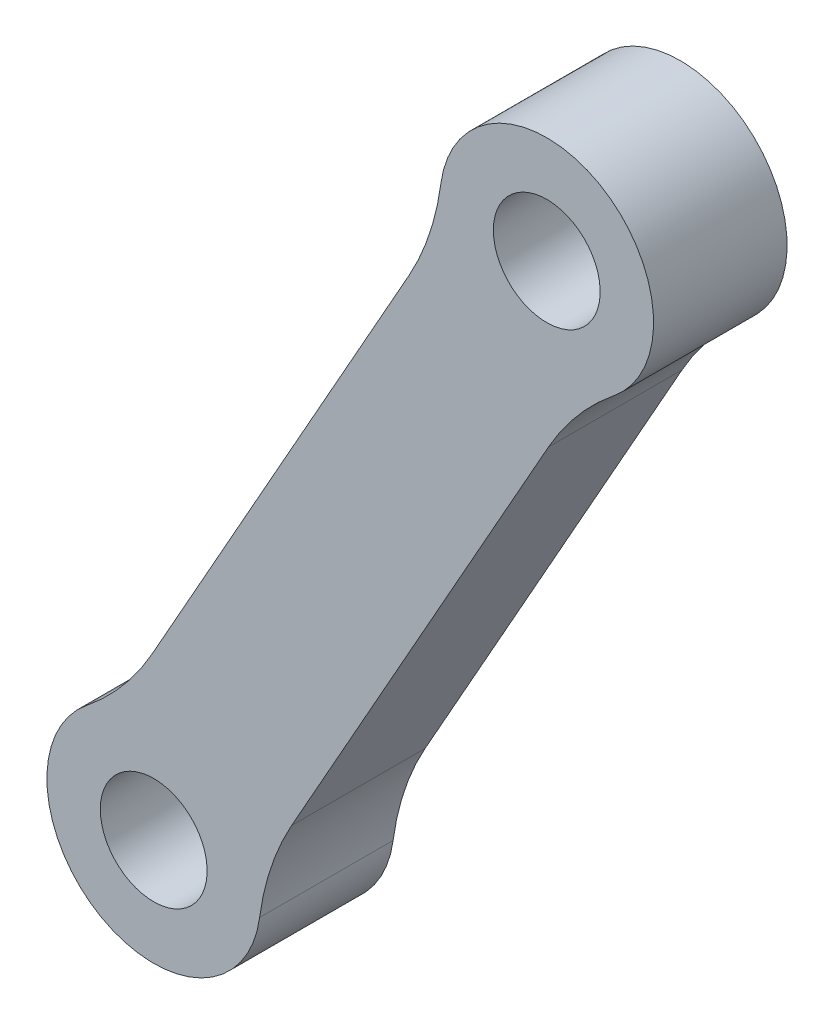
ISO-10303-21;
HEADER;
FILE_DESCRIPTION(('STEP AP214'),'2;1');
FILE_NAME('part.step','',(''),(''),'','','');
FILE_SCHEMA(('AUTOMOTIVE_DESIGN { 1 0 10303 214 1 1 1 1 }'));
ENDSEC;
DATA;
#1=APPLICATION_CONTEXT('core data for automotive mechanical design processes');
#2=APPLICATION_PROTOCOL_DEFINITION('international standard','automotive_design',2000,#1);
#3=PRODUCT_CONTEXT('',#1,'mechanical');
#4=PRODUCT('Part','Part','',(#3));
#5=PRODUCT_RELATED_PRODUCT_CATEGORY('part','',(#4));
#6=PRODUCT_DEFINITION_FORMATION('','',#4);
#7=PRODUCT_DEFINITION_CONTEXT('part definition',#1,'design');
#8=PRODUCT_DEFINITION('design','',#6,#7);
#9=PRODUCT_DEFINITION_SHAPE('','',#8);
#10=(LENGTH_UNIT() NAMED_UNIT(*) SI_UNIT(.MILLI.,.METRE.));
#11=(NAMED_UNIT(*) PLANE_ANGLE_UNIT() SI_UNIT($,.RADIAN.));
#12=(NAMED_UNIT(*) SI_UNIT($,.STERADIAN.) SOLID_ANGLE_UNIT());
#13=UNCERTAINTY_MEASURE_WITH_UNIT(LENGTH_MEASURE(1.E-05),#10,'distance_accuracy_value','');
#14=(GEOMETRIC_REPRESENTATION_CONTEXT(3) GLOBAL_UNCERTAINTY_ASSIGNED_CONTEXT((#13)) GLOBAL_UNIT_ASSIGNED_CONTEXT((#10,
#11,#12)) REPRESENTATION_CONTEXT('',''));
#15=CARTESIAN_POINT('',(0.,0.,0.));
#16=DIRECTION('',(0.,0.,1.));
#17=DIRECTION('',(1.,0.,0.));
#18=AXIS2_PLACEMENT_3D('',#15,#16,#17);
#19=CARTESIAN_POINT('',(22.1237617464884,10.2934075170326,58.));
#20=DIRECTION('',(0.,0.,1.));
#21=DIRECTION('',(1.,0.,0.));
#22=AXIS2_PLACEMENT_3D('',#19,#20,#21);
#23=CYLINDRICAL_SURFACE('',#22,10.);
#24=CARTESIAN_POINT('',(22.1237617464884,10.2934075170326,63.));
#25=DIRECTION('',(0.,0.,-1.));
#26=DIRECTION('',(-1.,0.,0.));
#27=AXIS2_PLACEMENT_3D('',#24,#25,#26);
#28=CIRCLE('',#27,10.);
#29=CARTESIAN_POINT('',(12.2115050047554,11.6152116954073,63.));
#30=VERTEX_POINT('',#29);
#31=CARTESIAN_POINT('',(13.4101159137224,15.1997683171695,63.));
#32=VERTEX_POINT('',#31);
#33=EDGE_CURVE('E134',#30,#32,#28,.T.);
#34=ORIENTED_EDGE('',*,*,#33,.F.);
#35=DIRECTION('',(0.,0.,1.));
#36=VECTOR('',#35,1.);
#37=CARTESIAN_POINT('',(12.2115050047554,11.6152116954073,58.));
#38=LINE('',#37,#36);
#39=CARTESIAN_POINT('',(12.2115050047554,11.6152116954073,58.));
#40=VERTEX_POINT('',#39);
#41=EDGE_CURVE('E11',#40,#30,#38,.T.);
#42=ORIENTED_EDGE('',*,*,#41,.F.);
#43=CARTESIAN_POINT('',(22.1237617464884,10.2934075170326,58.));
#44=DIRECTION('',(0.,0.,-1.));
#45=DIRECTION('',(-1.,0.,0.));
#46=AXIS2_PLACEMENT_3D('',#43,#44,#45);
#47=CIRCLE('',#46,10.);
#48=CARTESIAN_POINT('',(13.4101159137224,15.1997683171695,58.));
#49=VERTEX_POINT('',#48);
#50=EDGE_CURVE('E155',#40,#49,#47,.T.);
#51=ORIENTED_EDGE('',*,*,#50,.T.);
#52=DIRECTION('',(0.,0.,1.));
#53=VECTOR('',#52,1.);
#54=CARTESIAN_POINT('',(13.4101159137224,15.1997683171695,58.));
#55=LINE('',#54,#53);
#56=EDGE_CURVE('E40',#49,#32,#55,.T.);
#57=ORIENTED_EDGE('',*,*,#56,.T.);
#58=EDGE_LOOP('',(#34,#42,#51,#57));
#59=FACE_BOUND('',#58,.T.);
#60=ADVANCED_FACE('F37',(#59),#23,.F.);
#61=CARTESIAN_POINT('',(8.24660230806223,12.1439333667572,58.));
#62=DIRECTION('',(0.,0.,1.));
#63=DIRECTION('',(1.,0.,0.));
#64=AXIS2_PLACEMENT_3D('',#61,#62,#63);
#65=CYLINDRICAL_SURFACE('',#64,3.99999999999999);
#66=CARTESIAN_POINT('',(8.24660230806223,12.1439333667572,63.));
#67=DIRECTION('',(0.,0.,1.));
#68=DIRECTION('',(1.,0.,0.));
#69=AXIS2_PLACEMENT_3D('',#66,#67,#68);
#70=CIRCLE('',#69,3.99999999999999);
#71=CARTESIAN_POINT('',(5.73851095755782,15.2599368612233,63.));
#72=VERTEX_POINT('',#71);
#73=EDGE_CURVE('E153',#72,#30,#70,.T.);
#74=ORIENTED_EDGE('',*,*,#73,.F.);
#75=DIRECTION('',(0.,0.,1.));
#76=VECTOR('',#75,1.);
#77=CARTESIAN_POINT('',(5.73851095755782,15.2599368612233,58.));
#78=LINE('',#77,#76);
#79=CARTESIAN_POINT('',(5.73851095755782,15.2599368612233,58.));
#80=VERTEX_POINT('',#79);
#81=EDGE_CURVE('E46',#80,#72,#78,.T.);
#82=ORIENTED_EDGE('',*,*,#81,.F.);
#83=CARTESIAN_POINT('',(8.24660230806223,12.1439333667572,58.));
#84=DIRECTION('',(0.,0.,1.));
#85=DIRECTION('',(1.,0.,0.));
#86=AXIS2_PLACEMENT_3D('',#83,#84,#85);
#87=CIRCLE('',#86,3.99999999999999);
#88=EDGE_CURVE('E124',#80,#40,#87,.T.);
#89=ORIENTED_EDGE('',*,*,#88,.T.);
#90=ORIENTED_EDGE('',*,*,#41,.T.);
#91=EDGE_LOOP('',(#74,#82,#89,#90));
#92=FACE_BOUND('',#91,.T.);
#93=ADVANCED_FACE('F167',(#92),#65,.T.);
#94=CARTESIAN_POINT('',(-0.531717418703122,23.0499455973886,58.));
#95=DIRECTION('',(0.,0.,1.));
#96=DIRECTION('',(1.,0.,0.));
#97=AXIS2_PLACEMENT_3D('',#94,#95,#96);
#98=CYLINDRICAL_SURFACE('',#97,10.);
#99=CARTESIAN_POINT('',(-0.531717418703122,23.0499455973886,63.));
#100=DIRECTION('',(0.,0.,-1.));
#101=DIRECTION('',(-1.,0.,0.));
#102=AXIS2_PLACEMENT_3D('',#99,#100,#101);
#103=CIRCLE('',#102,10.);
#104=CARTESIAN_POINT('',(8.18192841406284,18.1435847972517,63.));
#105=VERTEX_POINT('',#104);
#106=EDGE_CURVE('E111',#105,#72,#103,.T.);
#107=ORIENTED_EDGE('',*,*,#106,.F.);
#108=DIRECTION('',(0.,0.,1.));
#109=VECTOR('',#108,1.);
#110=CARTESIAN_POINT('',(8.18192841406284,18.1435847972517,58.));
#111=LINE('',#110,#109);
#112=CARTESIAN_POINT('',(8.18192841406284,18.1435847972517,58.));
#113=VERTEX_POINT('',#112);
#114=EDGE_CURVE('E106',#113,#105,#111,.T.);
#115=ORIENTED_EDGE('',*,*,#114,.F.);
#116=CARTESIAN_POINT('',(-0.531717418703122,23.0499455973886,58.));
#117=DIRECTION('',(0.,0.,-1.));
#118=DIRECTION('',(-1.,0.,0.));
#119=AXIS2_PLACEMENT_3D('',#116,#117,#118);
#120=CIRCLE('',#119,10.);
#121=EDGE_CURVE('E109',#113,#80,#120,.T.);
#122=ORIENTED_EDGE('',*,*,#121,.T.);
#123=ORIENTED_EDGE('',*,*,#81,.T.);
#124=EDGE_LOOP('',(#107,#115,#122,#123));
#125=FACE_BOUND('',#124,.T.);
#126=ADVANCED_FACE('F108',(#125),#98,.F.);
#127=CARTESIAN_POINT('',(17.8021711028128,35.2290359146427,58.));
#128=DIRECTION('',(-0.871364583276596,0.490636080013694,0.));
#129=DIRECTION('',(-0.490636080013694,-0.871364583276596,0.));
#130=AXIS2_PLACEMENT_3D('',#127,#128,#129);
#131=PLANE('',#130);
#132=DIRECTION('',(-0.490636080013694,-0.871364583276596,0.));
#133=VECTOR('',#132,1.);
#134=CARTESIAN_POINT('',(17.8021711028128,35.2290359146427,63.));
#135=LINE('',#134,#133);
#136=CARTESIAN_POINT('',(17.8021711028128,35.2290359146427,63.));
#137=VERTEX_POINT('',#136);
#138=EDGE_CURVE('E150',#137,#105,#135,.T.);
#139=ORIENTED_EDGE('',*,*,#138,.F.);
#140=DIRECTION('',(0.,0.,1.));
#141=VECTOR('',#140,1.);
#142=CARTESIAN_POINT('',(17.8021711028128,35.2290359146427,58.));
#143=LINE('',#142,#141);
#144=CARTESIAN_POINT('',(17.8021711028128,35.2290359146427,58.));
#145=VERTEX_POINT('',#144);
#146=EDGE_CURVE('E116',#145,#137,#143,.T.);
#147=ORIENTED_EDGE('',*,*,#146,.F.);
#148=DIRECTION('',(-0.490636080013694,-0.871364583276596,0.));
#149=VECTOR('',#148,1.);
#150=CARTESIAN_POINT('',(17.8021711028128,35.2290359146427,58.));
#151=LINE('',#150,#149);
#152=EDGE_CURVE('E122',#145,#113,#151,.T.);
#153=ORIENTED_EDGE('',*,*,#152,.T.);
#154=ORIENTED_EDGE('',*,*,#114,.T.);
#155=EDGE_LOOP('',(#139,#147,#153,#154));
#156=FACE_BOUND('',#155,.T.);
#157=ADVANCED_FACE('F126',(#156),#131,.T.);
#158=CARTESIAN_POINT('',(9.08852527004682,40.1353967147796,58.));
#159=DIRECTION('',(0.,0.,1.));
#160=DIRECTION('',(1.,0.,0.));
#161=AXIS2_PLACEMENT_3D('',#158,#159,#160);
#162=CYLINDRICAL_SURFACE('',#161,10.);
#163=CARTESIAN_POINT('',(9.08852527004682,40.1353967147796,63.));
#164=DIRECTION('',(0.,0.,-1.));
#165=DIRECTION('',(-1.,0.,0.));
#166=AXIS2_PLACEMENT_3D('',#163,#164,#165);
#167=CIRCLE('',#166,10.);
#168=CARTESIAN_POINT('',(19.0007820117798,38.8135925364049,63.));
#169=VERTEX_POINT('',#168);
#170=EDGE_CURVE('E147',#169,#137,#167,.T.);
#171=ORIENTED_EDGE('',*,*,#170,.F.);
#172=DIRECTION('',(0.,0.,1.));
#173=VECTOR('',#172,1.);
#174=CARTESIAN_POINT('',(19.0007820117798,38.8135925364049,58.));
#175=LINE('',#174,#173);
#176=CARTESIAN_POINT('',(19.0007820117798,38.8135925364049,58.));
#177=VERTEX_POINT('',#176);
#178=EDGE_CURVE('E159',#177,#169,#175,.T.);
#179=ORIENTED_EDGE('',*,*,#178,.F.);
#180=CARTESIAN_POINT('',(9.08852527004682,40.1353967147796,58.));
#181=DIRECTION('',(0.,0.,-1.));
#182=DIRECTION('',(-1.,0.,0.));
#183=AXIS2_PLACEMENT_3D('',#180,#181,#182);
#184=CIRCLE('',#183,10.);
#185=EDGE_CURVE('E127',#177,#145,#184,.T.);
#186=ORIENTED_EDGE('',*,*,#185,.T.);
#187=ORIENTED_EDGE('',*,*,#146,.T.);
#188=EDGE_LOOP('',(#171,#179,#186,#187));
#189=FACE_BOUND('',#188,.T.);
#190=ADVANCED_FACE('F180',(#189),#162,.F.);
#191=CARTESIAN_POINT('',(22.965684708473,38.284870865055,58.));
#192=DIRECTION('',(0.,0.,1.));
#193=DIRECTION('',(1.,0.,0.));
#194=AXIS2_PLACEMENT_3D('',#191,#192,#193);
#195=CYLINDRICAL_SURFACE('',#194,4.);
#196=CARTESIAN_POINT('',(22.965684708473,38.284870865055,63.));
#197=DIRECTION('',(0.,0.,1.));
#198=DIRECTION('',(1.,0.,0.));
#199=AXIS2_PLACEMENT_3D('',#196,#197,#198);
#200=CIRCLE('',#199,4.);
#201=CARTESIAN_POINT('',(25.4737760589774,35.1688673705889,63.));
#202=VERTEX_POINT('',#201);
#203=EDGE_CURVE('E144',#202,#169,#200,.T.);
#204=ORIENTED_EDGE('',*,*,#203,.F.);
#205=DIRECTION('',(0.,0.,1.));
#206=VECTOR('',#205,1.);
#207=CARTESIAN_POINT('',(25.4737760589774,35.1688673705889,58.));
#208=LINE('',#207,#206);
#209=CARTESIAN_POINT('',(25.4737760589774,35.1688673705889,58.));
#210=VERTEX_POINT('',#209);
#211=EDGE_CURVE('E161',#210,#202,#208,.T.);
#212=ORIENTED_EDGE('',*,*,#211,.F.);
#213=CARTESIAN_POINT('',(22.965684708473,38.284870865055,58.));
#214=DIRECTION('',(0.,0.,1.));
#215=DIRECTION('',(1.,0.,0.));
#216=AXIS2_PLACEMENT_3D('',#213,#214,#215);
#217=CIRCLE('',#216,4.);
#218=EDGE_CURVE('E129',#210,#177,#217,.T.);
#219=ORIENTED_EDGE('',*,*,#218,.T.);
#220=ORIENTED_EDGE('',*,*,#178,.T.);
#221=EDGE_LOOP('',(#204,#212,#219,#220));
#222=FACE_BOUND('',#221,.T.);
#223=ADVANCED_FACE('F183',(#222),#195,.T.);
#224=CARTESIAN_POINT('',(31.7440044352383,27.3788586344236,58.));
#225=DIRECTION('',(0.,0.,1.));
#226=DIRECTION('',(1.,0.,0.));
#227=AXIS2_PLACEMENT_3D('',#224,#225,#226);
#228=CYLINDRICAL_SURFACE('',#227,10.);
#229=CARTESIAN_POINT('',(31.7440044352383,27.3788586344236,63.));
#230=DIRECTION('',(0.,0.,-1.));
#231=DIRECTION('',(-1.,0.,0.));
#232=AXIS2_PLACEMENT_3D('',#229,#230,#231);
#233=CIRCLE('',#232,10.);
#234=CARTESIAN_POINT('',(23.0303586024724,32.2852194345605,63.));
#235=VERTEX_POINT('',#234);
#236=EDGE_CURVE('E141',#235,#202,#233,.T.);
#237=ORIENTED_EDGE('',*,*,#236,.F.);
#238=DIRECTION('',(0.,0.,1.));
#239=VECTOR('',#238,1.);
#240=CARTESIAN_POINT('',(23.0303586024724,32.2852194345605,58.));
#241=LINE('',#240,#239);
#242=CARTESIAN_POINT('',(23.0303586024724,32.2852194345605,58.));
#243=VERTEX_POINT('',#242);
#244=EDGE_CURVE('E162',#243,#235,#241,.T.);
#245=ORIENTED_EDGE('',*,*,#244,.F.);
#246=CARTESIAN_POINT('',(31.7440044352383,27.3788586344236,58.));
#247=DIRECTION('',(0.,0.,-1.));
#248=DIRECTION('',(-1.,0.,0.));
#249=AXIS2_PLACEMENT_3D('',#246,#247,#248);
#250=CIRCLE('',#249,10.);
#251=EDGE_CURVE('E229',#243,#210,#250,.T.);
#252=ORIENTED_EDGE('',*,*,#251,.T.);
#253=ORIENTED_EDGE('',*,*,#211,.T.);
#254=EDGE_LOOP('',(#237,#245,#252,#253));
#255=FACE_BOUND('',#254,.T.);
#256=ADVANCED_FACE('F187',(#255),#228,.F.);
#257=CARTESIAN_POINT('',(13.4101159137224,15.1997683171695,58.));
#258=DIRECTION('',(0.871364583276596,-0.490636080013694,0.));
#259=DIRECTION('',(0.490636080013694,0.871364583276596,0.));
#260=AXIS2_PLACEMENT_3D('',#257,#258,#259);
#261=PLANE('',#260);
#262=DIRECTION('',(0.490636080013694,0.871364583276596,0.));
#263=VECTOR('',#262,1.);
#264=CARTESIAN_POINT('',(13.4101159137224,15.1997683171695,63.));
#265=LINE('',#264,#263);
#266=EDGE_CURVE('E137',#32,#235,#265,.T.);
#267=ORIENTED_EDGE('',*,*,#266,.F.);
#268=ORIENTED_EDGE('',*,*,#56,.F.);
#269=DIRECTION('',(0.490636080013694,0.871364583276596,0.));
#270=VECTOR('',#269,1.);
#271=CARTESIAN_POINT('',(13.4101159137224,15.1997683171695,58.));
#272=LINE('',#271,#270);
#273=EDGE_CURVE('E227',#49,#243,#272,.T.);
#274=ORIENTED_EDGE('',*,*,#273,.T.);
#275=ORIENTED_EDGE('',*,*,#244,.T.);
#276=EDGE_LOOP('',(#267,#268,#274,#275));
#277=FACE_BOUND('',#276,.T.);
#278=ADVANCED_FACE('F164',(#277),#261,.T.);
#279=CARTESIAN_POINT('',(22.1237617464884,10.2934075170326,58.));
#280=DIRECTION('',(0.,0.,-1.));
#281=DIRECTION('',(-1.,0.,0.));
#282=AXIS2_PLACEMENT_3D('',#279,#280,#281);
#283=PLANE('',#282);
#284=CARTESIAN_POINT('',(22.965684708473,38.284870865055,58.));
#285=DIRECTION('',(0.,0.,1.));
#286=DIRECTION('',(-1.,0.,0.));
#287=AXIS2_PLACEMENT_3D('',#284,#285,#286);
#288=CIRCLE('',#287,2.);
#289=CARTESIAN_POINT('',(20.965684708473,38.284870865055,58.));
#290=VERTEX_POINT('',#289);
#291=EDGE_CURVE('E214',#290,#290,#288,.T.);
#292=ORIENTED_EDGE('',*,*,#291,.T.);
#293=EDGE_LOOP('',(#292));
#294=FACE_BOUND('',#293,.T.);
#295=CARTESIAN_POINT('',(8.24660230806223,12.1439333667572,58.));
#296=DIRECTION('',(0.,0.,1.));
#297=DIRECTION('',(-1.,0.,0.));
#298=AXIS2_PLACEMENT_3D('',#295,#296,#297);
#299=CIRCLE('',#298,2.);
#300=CARTESIAN_POINT('',(6.24660230806223,12.1439333667572,58.));
#301=VERTEX_POINT('',#300);
#302=EDGE_CURVE('E138',#301,#301,#299,.T.);
#303=ORIENTED_EDGE('',*,*,#302,.T.);
#304=EDGE_LOOP('',(#303));
#305=FACE_BOUND('',#304,.T.);
#306=ORIENTED_EDGE('',*,*,#50,.F.);
#307=ORIENTED_EDGE('',*,*,#88,.F.);
#308=ORIENTED_EDGE('',*,*,#121,.F.);
#309=ORIENTED_EDGE('',*,*,#152,.F.);
#310=ORIENTED_EDGE('',*,*,#185,.F.);
#311=ORIENTED_EDGE('',*,*,#218,.F.);
#312=ORIENTED_EDGE('',*,*,#251,.F.);
#313=ORIENTED_EDGE('',*,*,#273,.F.);
#314=EDGE_LOOP('',(#306,#307,#308,#309,#310,#311,#312,#313));
#315=FACE_BOUND('',#314,.T.);
#316=ADVANCED_FACE('F120',(#294,#305,#315),#283,.T.);
#317=CARTESIAN_POINT('',(22.1237617464884,10.2934075170326,63.));
#318=DIRECTION('',(0.,0.,-1.));
#319=DIRECTION('',(-1.,0.,0.));
#320=AXIS2_PLACEMENT_3D('',#317,#318,#319);
#321=PLANE('',#320);
#322=CARTESIAN_POINT('',(22.965684708473,38.284870865055,63.));
#323=DIRECTION('',(0.,0.,1.));
#324=DIRECTION('',(-1.,0.,0.));
#325=AXIS2_PLACEMENT_3D('',#322,#323,#324);
#326=CIRCLE('',#325,2.);
#327=CARTESIAN_POINT('',(20.965684708473,38.284870865055,63.));
#328=VERTEX_POINT('',#327);
#329=EDGE_CURVE('E217',#328,#328,#326,.T.);
#330=ORIENTED_EDGE('',*,*,#329,.F.);
#331=EDGE_LOOP('',(#330));
#332=FACE_BOUND('',#331,.T.);
#333=CARTESIAN_POINT('',(8.24660230806223,12.1439333667572,63.));
#334=DIRECTION('',(0.,0.,1.));
#335=DIRECTION('',(-1.,0.,0.));
#336=AXIS2_PLACEMENT_3D('',#333,#334,#335);
#337=CIRCLE('',#336,2.);
#338=CARTESIAN_POINT('',(6.24660230806223,12.1439333667572,63.));
#339=VERTEX_POINT('',#338);
#340=EDGE_CURVE('E219',#339,#339,#337,.T.);
#341=ORIENTED_EDGE('',*,*,#340,.F.);
#342=EDGE_LOOP('',(#341));
#343=FACE_BOUND('',#342,.T.);
#344=ORIENTED_EDGE('',*,*,#33,.T.);
#345=ORIENTED_EDGE('',*,*,#266,.T.);
#346=ORIENTED_EDGE('',*,*,#236,.T.);
#347=ORIENTED_EDGE('',*,*,#203,.T.);
#348=ORIENTED_EDGE('',*,*,#170,.T.);
#349=ORIENTED_EDGE('',*,*,#138,.T.);
#350=ORIENTED_EDGE('',*,*,#106,.T.);
#351=ORIENTED_EDGE('',*,*,#73,.T.);
#352=EDGE_LOOP('',(#344,#345,#346,#347,#348,#349,#350,#351));
#353=FACE_BOUND('',#352,.T.);
#354=ADVANCED_FACE('F166',(#332,#343,#353),#321,.F.);
#355=CARTESIAN_POINT('',(8.24660230806223,12.1439333667572,58.));
#356=DIRECTION('',(0.,0.,1.));
#357=DIRECTION('',(1.,0.,0.));
#358=AXIS2_PLACEMENT_3D('',#355,#356,#357);
#359=CYLINDRICAL_SURFACE('',#358,2.);
#360=ORIENTED_EDGE('',*,*,#302,.F.);
#361=EDGE_LOOP('',(#360));
#362=FACE_BOUND('',#361,.T.);
#363=ORIENTED_EDGE('',*,*,#340,.T.);
#364=EDGE_LOOP('',(#363));
#365=FACE_BOUND('',#364,.T.);
#366=ADVANCED_FACE('F199',(#362,#365),#359,.F.);
#367=CARTESIAN_POINT('',(22.965684708473,38.284870865055,58.));
#368=DIRECTION('',(0.,0.,1.));
#369=DIRECTION('',(1.,0.,0.));
#370=AXIS2_PLACEMENT_3D('',#367,#368,#369);
#371=CYLINDRICAL_SURFACE('',#370,2.);
#372=ORIENTED_EDGE('',*,*,#291,.F.);
#373=EDGE_LOOP('',(#372));
#374=FACE_BOUND('',#373,.T.);
#375=ORIENTED_EDGE('',*,*,#329,.T.);
#376=EDGE_LOOP('',(#375));
#377=FACE_BOUND('',#376,.T.);
#378=ADVANCED_FACE('F206',(#374,#377),#371,.F.);
#379=CLOSED_SHELL('',(#60,#93,#126,#157,#190,#223,#256,#278,#316,#354,#366,#378));
#380=MANIFOLD_SOLID_BREP('B2',#379);
#381=ADVANCED_BREP_SHAPE_REPRESENTATION('',(#18,#380),#14);
#382=SHAPE_DEFINITION_REPRESENTATION(#9,#381);
ENDSEC;
END-ISO-10303-21;
